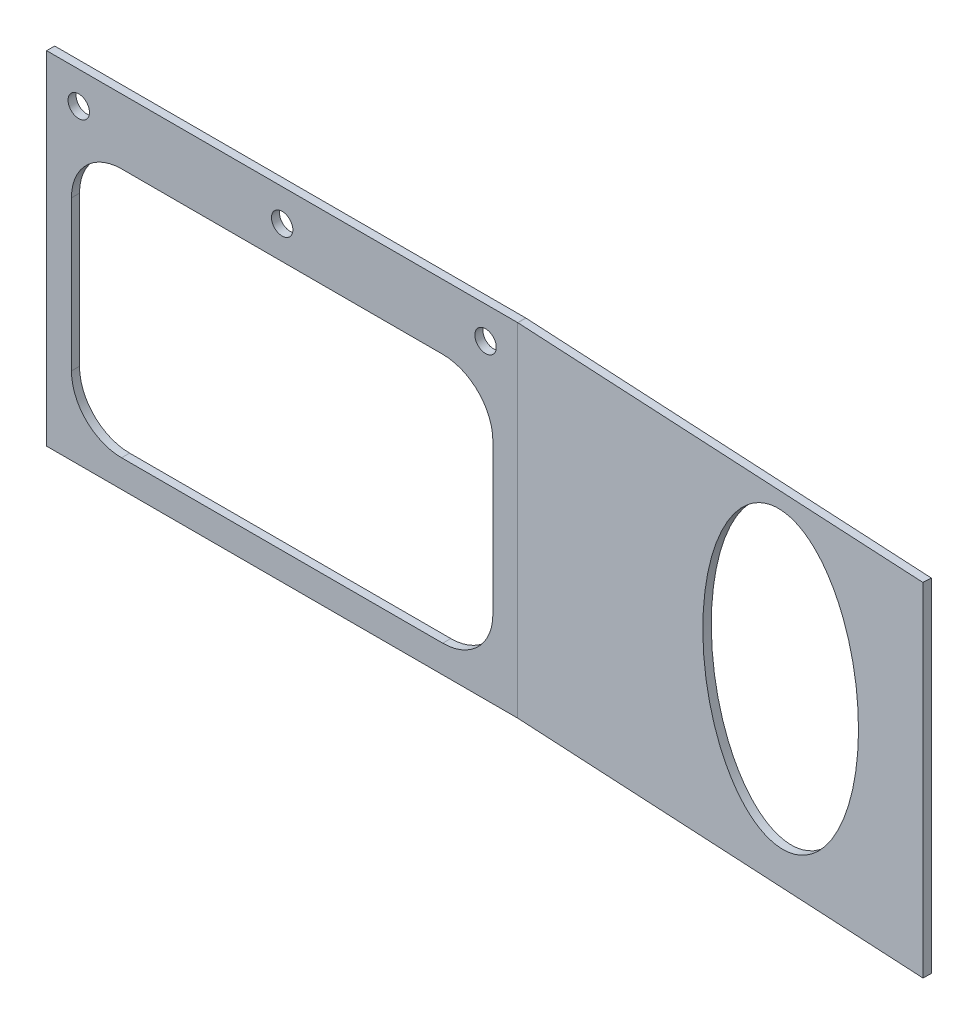
ISO-10303-21;
HEADER;
FILE_DESCRIPTION(('STEP AP214'),'2;1');
FILE_NAME('part.step','',(''),(''),'','','');
FILE_SCHEMA(('AUTOMOTIVE_DESIGN { 1 0 10303 214 1 1 1 1 }'));
ENDSEC;
DATA;
#1=APPLICATION_CONTEXT('core data for automotive mechanical design processes');
#2=APPLICATION_PROTOCOL_DEFINITION('international standard','automotive_design',2000,#1);
#3=PRODUCT_CONTEXT('',#1,'mechanical');
#4=PRODUCT('Part','Part','',(#3));
#5=PRODUCT_RELATED_PRODUCT_CATEGORY('part','',(#4));
#6=PRODUCT_DEFINITION_FORMATION('','',#4);
#7=PRODUCT_DEFINITION_CONTEXT('part definition',#1,'design');
#8=PRODUCT_DEFINITION('design','',#6,#7);
#9=PRODUCT_DEFINITION_SHAPE('','',#8);
#10=(LENGTH_UNIT() NAMED_UNIT(*) SI_UNIT(.MILLI.,.METRE.));
#11=(NAMED_UNIT(*) PLANE_ANGLE_UNIT() SI_UNIT($,.RADIAN.));
#12=(NAMED_UNIT(*) SI_UNIT($,.STERADIAN.) SOLID_ANGLE_UNIT());
#13=UNCERTAINTY_MEASURE_WITH_UNIT(LENGTH_MEASURE(1.E-05),#10,'distance_accuracy_value','');
#14=(GEOMETRIC_REPRESENTATION_CONTEXT(3) GLOBAL_UNCERTAINTY_ASSIGNED_CONTEXT((#13)) GLOBAL_UNIT_ASSIGNED_CONTEXT((#10,
#11,#12)) REPRESENTATION_CONTEXT('',''));
#15=CARTESIAN_POINT('',(0.,0.,0.));
#16=DIRECTION('',(0.,0.,1.));
#17=DIRECTION('',(1.,0.,0.));
#18=AXIS2_PLACEMENT_3D('',#15,#16,#17);
#19=CARTESIAN_POINT('',(-279.4,0.,-4.7752));
#20=DIRECTION('',(0.,0.,-1.));
#21=DIRECTION('',(-1.,0.,0.));
#22=AXIS2_PLACEMENT_3D('',#19,#20,#21);
#23=PLANE('',#22);
#24=CARTESIAN_POINT('',(-19.05,184.15,-4.7752));
#25=DIRECTION('',(0.,0.,-1.));
#26=DIRECTION('',(-1.,0.,0.));
#27=AXIS2_PLACEMENT_3D('',#24,#25,#26);
#28=CIRCLE('',#27,6.35);
#29=CARTESIAN_POINT('',(-25.4,184.15,-4.7752));
#30=VERTEX_POINT('',#29);
#31=EDGE_CURVE('E249',#30,#30,#28,.T.);
#32=ORIENTED_EDGE('',*,*,#31,.F.);
#33=EDGE_LOOP('',(#32));
#34=FACE_BOUND('',#33,.T.);
#35=CARTESIAN_POINT('',(-139.7,184.15,-4.7752));
#36=DIRECTION('',(0.,0.,-1.));
#37=DIRECTION('',(-1.,0.,0.));
#38=AXIS2_PLACEMENT_3D('',#35,#36,#37);
#39=CIRCLE('',#38,6.34999999999999);
#40=CARTESIAN_POINT('',(-146.05,184.15,-4.7752));
#41=VERTEX_POINT('',#40);
#42=EDGE_CURVE('E254',#41,#41,#39,.T.);
#43=ORIENTED_EDGE('',*,*,#42,.F.);
#44=EDGE_LOOP('',(#43));
#45=FACE_BOUND('',#44,.T.);
#46=CARTESIAN_POINT('',(-260.35,184.15,-4.7752));
#47=DIRECTION('',(0.,0.,-1.));
#48=DIRECTION('',(-1.,0.,0.));
#49=AXIS2_PLACEMENT_3D('',#46,#47,#48);
#50=CIRCLE('',#49,6.34999999999994);
#51=CARTESIAN_POINT('',(-266.7,184.15,-4.7752));
#52=VERTEX_POINT('',#51);
#53=EDGE_CURVE('E257',#52,#52,#50,.T.);
#54=ORIENTED_EDGE('',*,*,#53,.F.);
#55=EDGE_LOOP('',(#54));
#56=FACE_BOUND('',#55,.T.);
#57=CARTESIAN_POINT('',(-44.45,134.9375,-4.7752));
#58=DIRECTION('',(0.,0.,-1.));
#59=DIRECTION('',(-1.,0.,0.));
#60=AXIS2_PLACEMENT_3D('',#57,#58,#59);
#61=CIRCLE('',#60,29.7434);
#62=CARTESIAN_POINT('',(-44.45,164.6809,-4.7752));
#63=VERTEX_POINT('',#62);
#64=CARTESIAN_POINT('',(-14.7066,134.9375,-4.7752));
#65=VERTEX_POINT('',#64);
#66=EDGE_CURVE('E259',#63,#65,#61,.T.);
#67=ORIENTED_EDGE('',*,*,#66,.F.);
#68=DIRECTION('',(1.,0.,0.));
#69=VECTOR('',#68,1.);
#70=CARTESIAN_POINT('',(-44.45,164.6809,-4.7752));
#71=LINE('',#70,#69);
#72=CARTESIAN_POINT('',(-234.95,164.6809,-4.7752));
#73=VERTEX_POINT('',#72);
#74=EDGE_CURVE('E277',#73,#63,#71,.T.);
#75=ORIENTED_EDGE('',*,*,#74,.F.);
#76=CARTESIAN_POINT('',(-234.95,134.9375,-4.7752));
#77=DIRECTION('',(0.,0.,-1.));
#78=DIRECTION('',(-1.,0.,0.));
#79=AXIS2_PLACEMENT_3D('',#76,#77,#78);
#80=CIRCLE('',#79,29.7434);
#81=CARTESIAN_POINT('',(-264.6934,134.9375,-4.7752));
#82=VERTEX_POINT('',#81);
#83=EDGE_CURVE('E274',#82,#73,#80,.T.);
#84=ORIENTED_EDGE('',*,*,#83,.F.);
#85=DIRECTION('',(0.,1.,0.));
#86=VECTOR('',#85,1.);
#87=CARTESIAN_POINT('',(-264.6934,134.9375,-4.7752));
#88=LINE('',#87,#86);
#89=CARTESIAN_POINT('',(-264.6934,46.0375,-4.7752));
#90=VERTEX_POINT('',#89);
#91=EDGE_CURVE('E271',#90,#82,#88,.T.);
#92=ORIENTED_EDGE('',*,*,#91,.F.);
#93=CARTESIAN_POINT('',(-234.95,46.0375,-4.7752));
#94=DIRECTION('',(0.,0.,-1.));
#95=DIRECTION('',(1.,0.,0.));
#96=AXIS2_PLACEMENT_3D('',#93,#94,#95);
#97=CIRCLE('',#96,29.7434);
#98=CARTESIAN_POINT('',(-234.95,16.2941,-4.7752));
#99=VERTEX_POINT('',#98);
#100=EDGE_CURVE('E268',#99,#90,#97,.T.);
#101=ORIENTED_EDGE('',*,*,#100,.F.);
#102=DIRECTION('',(-1.,0.,0.));
#103=VECTOR('',#102,1.);
#104=CARTESIAN_POINT('',(-44.45,16.2941,-4.7752));
#105=LINE('',#104,#103);
#106=CARTESIAN_POINT('',(-44.45,16.2941,-4.7752));
#107=VERTEX_POINT('',#106);
#108=EDGE_CURVE('E265',#107,#99,#105,.T.);
#109=ORIENTED_EDGE('',*,*,#108,.F.);
#110=CARTESIAN_POINT('',(-44.45,46.0375,-4.7752));
#111=DIRECTION('',(0.,0.,-1.));
#112=DIRECTION('',(-1.,0.,0.));
#113=AXIS2_PLACEMENT_3D('',#110,#111,#112);
#114=CIRCLE('',#113,29.7434);
#115=CARTESIAN_POINT('',(-14.7066,46.0375,-4.7752));
#116=VERTEX_POINT('',#115);
#117=EDGE_CURVE('E262',#116,#107,#114,.T.);
#118=ORIENTED_EDGE('',*,*,#117,.F.);
#119=DIRECTION('',(0.,-1.,0.));
#120=VECTOR('',#119,1.);
#121=CARTESIAN_POINT('',(-14.7066,134.9375,-4.7752));
#122=LINE('',#121,#120);
#123=EDGE_CURVE('E56',#65,#116,#122,.T.);
#124=ORIENTED_EDGE('',*,*,#123,.F.);
#125=EDGE_LOOP('',(#67,#75,#84,#92,#101,#109,#118,#124));
#126=FACE_BOUND('',#125,.T.);
#127=DIRECTION('',(1.,0.,0.));
#128=VECTOR('',#127,1.);
#129=CARTESIAN_POINT('',(-279.4,203.2,-4.7752));
#130=LINE('',#129,#128);
#131=CARTESIAN_POINT('',(-279.4,203.2,-4.7752));
#132=VERTEX_POINT('',#131);
#133=CARTESIAN_POINT('',(-0.00665122407857607,203.2,-4.7752000000003));
#134=VERTEX_POINT('',#133);
#135=EDGE_CURVE('E231',#132,#134,#130,.T.);
#136=ORIENTED_EDGE('',*,*,#135,.T.);
#137=DIRECTION('',(0.,1.,0.));
#138=VECTOR('',#137,1.);
#139=CARTESIAN_POINT('',(-0.00665122407857606,203.2,-4.7752000000003));
#140=LINE('',#139,#138);
#141=CARTESIAN_POINT('',(-0.00665122407857608,0.,-4.7752));
#142=VERTEX_POINT('',#141);
#143=EDGE_CURVE('E208',#134,#142,#140,.F.);
#144=ORIENTED_EDGE('',*,*,#143,.T.);
#145=DIRECTION('',(1.,0.,0.));
#146=VECTOR('',#145,1.);
#147=CARTESIAN_POINT('',(-279.4,0.,-4.7752));
#148=LINE('',#147,#146);
#149=CARTESIAN_POINT('',(-279.4,0.,-4.7752));
#150=VERTEX_POINT('',#149);
#151=EDGE_CURVE('E234',#150,#142,#148,.T.);
#152=ORIENTED_EDGE('',*,*,#151,.F.);
#153=DIRECTION('',(0.,1.,0.));
#154=VECTOR('',#153,1.);
#155=CARTESIAN_POINT('',(-279.4,0.,-4.7752));
#156=LINE('',#155,#154);
#157=EDGE_CURVE('E217',#150,#132,#156,.T.);
#158=ORIENTED_EDGE('',*,*,#157,.T.);
#159=EDGE_LOOP('',(#136,#144,#152,#158));
#160=FACE_BOUND('',#159,.T.);
#161=ADVANCED_FACE('F48',(#34,#45,#56,#126,#160),#23,.T.);
#162=CARTESIAN_POINT('',(-279.4,0.,-4.7752));
#163=DIRECTION('',(0.,1.,0.));
#164=DIRECTION('',(0.,0.,1.));
#165=AXIS2_PLACEMENT_3D('',#162,#163,#164);
#166=PLANE('',#165);
#167=DIRECTION('',(0.,0.,-1.));
#168=VECTOR('',#167,1.);
#169=CARTESIAN_POINT('',(-0.00665122407857607,0.,0.));
#170=LINE('',#169,#168);
#171=CARTESIAN_POINT('',(-0.00665122407857607,0.,0.));
#172=VERTEX_POINT('',#171);
#173=EDGE_CURVE('E215',#172,#142,#170,.T.);
#174=ORIENTED_EDGE('',*,*,#173,.F.);
#175=DIRECTION('',(1.,0.,0.));
#176=VECTOR('',#175,1.);
#177=CARTESIAN_POINT('',(-279.4,0.,0.));
#178=LINE('',#177,#176);
#179=CARTESIAN_POINT('',(-279.4,0.,0.));
#180=VERTEX_POINT('',#179);
#181=EDGE_CURVE('E230',#180,#172,#178,.T.);
#182=ORIENTED_EDGE('',*,*,#181,.F.);
#183=DIRECTION('',(0.,0.,1.));
#184=VECTOR('',#183,1.);
#185=CARTESIAN_POINT('',(-279.4,0.,-4.7752));
#186=LINE('',#185,#184);
#187=EDGE_CURVE('E238',#150,#180,#186,.T.);
#188=ORIENTED_EDGE('',*,*,#187,.F.);
#189=ORIENTED_EDGE('',*,*,#151,.T.);
#190=EDGE_LOOP('',(#174,#182,#188,#189));
#191=FACE_BOUND('',#190,.T.);
#192=ADVANCED_FACE('F357',(#191),#166,.F.);
#193=CARTESIAN_POINT('',(-279.4,0.,0.));
#194=DIRECTION('',(0.,0.,-1.));
#195=DIRECTION('',(-1.,0.,0.));
#196=AXIS2_PLACEMENT_3D('',#193,#194,#195);
#197=PLANE('',#196);
#198=CARTESIAN_POINT('',(-19.05,184.15,0.));
#199=DIRECTION('',(0.,0.,-1.));
#200=DIRECTION('',(-1.,0.,0.));
#201=AXIS2_PLACEMENT_3D('',#198,#199,#200);
#202=CIRCLE('',#201,6.35);
#203=CARTESIAN_POINT('',(-25.4,184.15,0.));
#204=VERTEX_POINT('',#203);
#205=EDGE_CURVE('E227',#204,#204,#202,.T.);
#206=ORIENTED_EDGE('',*,*,#205,.T.);
#207=EDGE_LOOP('',(#206));
#208=FACE_BOUND('',#207,.T.);
#209=CARTESIAN_POINT('',(-139.7,184.15,0.));
#210=DIRECTION('',(0.,0.,-1.));
#211=DIRECTION('',(-1.,0.,0.));
#212=AXIS2_PLACEMENT_3D('',#209,#210,#211);
#213=CIRCLE('',#212,6.34999999999999);
#214=CARTESIAN_POINT('',(-146.05,184.15,0.));
#215=VERTEX_POINT('',#214);
#216=EDGE_CURVE('E223',#215,#215,#213,.T.);
#217=ORIENTED_EDGE('',*,*,#216,.T.);
#218=EDGE_LOOP('',(#217));
#219=FACE_BOUND('',#218,.T.);
#220=CARTESIAN_POINT('',(-260.35,184.15,0.));
#221=DIRECTION('',(0.,0.,-1.));
#222=DIRECTION('',(-1.,0.,0.));
#223=AXIS2_PLACEMENT_3D('',#220,#221,#222);
#224=CIRCLE('',#223,6.34999999999994);
#225=CARTESIAN_POINT('',(-266.7,184.15,0.));
#226=VERTEX_POINT('',#225);
#227=EDGE_CURVE('E220',#226,#226,#224,.T.);
#228=ORIENTED_EDGE('',*,*,#227,.T.);
#229=EDGE_LOOP('',(#228));
#230=FACE_BOUND('',#229,.T.);
#231=DIRECTION('',(1.,0.,0.));
#232=VECTOR('',#231,1.);
#233=CARTESIAN_POINT('',(-44.45,164.6809,0.));
#234=LINE('',#233,#232);
#235=CARTESIAN_POINT('',(-234.95,164.6809,0.));
#236=VERTEX_POINT('',#235);
#237=CARTESIAN_POINT('',(-44.45,164.6809,0.));
#238=VERTEX_POINT('',#237);
#239=EDGE_CURVE('E243',#236,#238,#234,.T.);
#240=ORIENTED_EDGE('',*,*,#239,.T.);
#241=CARTESIAN_POINT('',(-44.45,134.9375,0.));
#242=DIRECTION('',(0.,0.,-1.));
#243=DIRECTION('',(-1.,0.,0.));
#244=AXIS2_PLACEMENT_3D('',#241,#242,#243);
#245=CIRCLE('',#244,29.7434);
#246=CARTESIAN_POINT('',(-14.7066,134.9375,0.));
#247=VERTEX_POINT('',#246);
#248=EDGE_CURVE('E282',#238,#247,#245,.T.);
#249=ORIENTED_EDGE('',*,*,#248,.T.);
#250=DIRECTION('',(0.,-1.,0.));
#251=VECTOR('',#250,1.);
#252=CARTESIAN_POINT('',(-14.7066,134.9375,0.));
#253=LINE('',#252,#251);
#254=CARTESIAN_POINT('',(-14.7066,46.0375,0.));
#255=VERTEX_POINT('',#254);
#256=EDGE_CURVE('E297',#247,#255,#253,.T.);
#257=ORIENTED_EDGE('',*,*,#256,.T.);
#258=CARTESIAN_POINT('',(-44.45,46.0375,0.));
#259=DIRECTION('',(0.,0.,-1.));
#260=DIRECTION('',(-1.,0.,0.));
#261=AXIS2_PLACEMENT_3D('',#258,#259,#260);
#262=CIRCLE('',#261,29.7434);
#263=CARTESIAN_POINT('',(-44.45,16.2941,0.));
#264=VERTEX_POINT('',#263);
#265=EDGE_CURVE('E294',#255,#264,#262,.T.);
#266=ORIENTED_EDGE('',*,*,#265,.T.);
#267=DIRECTION('',(-1.,0.,0.));
#268=VECTOR('',#267,1.);
#269=CARTESIAN_POINT('',(-44.45,16.2941,0.));
#270=LINE('',#269,#268);
#271=CARTESIAN_POINT('',(-234.95,16.2941,0.));
#272=VERTEX_POINT('',#271);
#273=EDGE_CURVE('E291',#264,#272,#270,.T.);
#274=ORIENTED_EDGE('',*,*,#273,.T.);
#275=CARTESIAN_POINT('',(-234.95,46.0375,0.));
#276=DIRECTION('',(0.,0.,-1.));
#277=DIRECTION('',(1.,0.,0.));
#278=AXIS2_PLACEMENT_3D('',#275,#276,#277);
#279=CIRCLE('',#278,29.7434);
#280=CARTESIAN_POINT('',(-264.6934,46.0375,0.));
#281=VERTEX_POINT('',#280);
#282=EDGE_CURVE('E288',#272,#281,#279,.T.);
#283=ORIENTED_EDGE('',*,*,#282,.T.);
#284=DIRECTION('',(0.,1.,0.));
#285=VECTOR('',#284,1.);
#286=CARTESIAN_POINT('',(-264.6934,134.9375,0.));
#287=LINE('',#286,#285);
#288=CARTESIAN_POINT('',(-264.6934,134.9375,0.));
#289=VERTEX_POINT('',#288);
#290=EDGE_CURVE('E285',#281,#289,#287,.T.);
#291=ORIENTED_EDGE('',*,*,#290,.T.);
#292=CARTESIAN_POINT('',(-234.95,134.9375,0.));
#293=DIRECTION('',(0.,0.,-1.));
#294=DIRECTION('',(-1.,0.,0.));
#295=AXIS2_PLACEMENT_3D('',#292,#293,#294);
#296=CIRCLE('',#295,29.7434);
#297=EDGE_CURVE('E224',#289,#236,#296,.T.);
#298=ORIENTED_EDGE('',*,*,#297,.T.);
#299=EDGE_LOOP('',(#240,#249,#257,#266,#274,#283,#291,#298));
#300=FACE_BOUND('',#299,.T.);
#301=DIRECTION('',(0.,1.,0.));
#302=VECTOR('',#301,1.);
#303=CARTESIAN_POINT('',(-0.00665122407857607,203.2,-3.0457618658304E-13));
#304=LINE('',#303,#302);
#305=CARTESIAN_POINT('',(-0.00665122407857607,203.2,-3.04552390251178E-13));
#306=VERTEX_POINT('',#305);
#307=EDGE_CURVE('E204',#306,#172,#304,.F.);
#308=ORIENTED_EDGE('',*,*,#307,.F.);
#309=DIRECTION('',(1.,0.,0.));
#310=VECTOR('',#309,1.);
#311=CARTESIAN_POINT('',(-279.4,203.2,0.));
#312=LINE('',#311,#310);
#313=CARTESIAN_POINT('',(-279.4,203.2,0.));
#314=VERTEX_POINT('',#313);
#315=EDGE_CURVE('E235',#314,#306,#312,.T.);
#316=ORIENTED_EDGE('',*,*,#315,.F.);
#317=DIRECTION('',(0.,1.,0.));
#318=VECTOR('',#317,1.);
#319=CARTESIAN_POINT('',(-279.4,0.,0.));
#320=LINE('',#319,#318);
#321=EDGE_CURVE('E245',#180,#314,#320,.T.);
#322=ORIENTED_EDGE('',*,*,#321,.F.);
#323=ORIENTED_EDGE('',*,*,#181,.T.);
#324=EDGE_LOOP('',(#308,#316,#322,#323));
#325=FACE_BOUND('',#324,.T.);
#326=ADVANCED_FACE('F333',(#208,#219,#230,#300,#325),#197,.F.);
#327=CARTESIAN_POINT('',(-279.4,203.2,0.));
#328=DIRECTION('',(0.,-1.,0.));
#329=DIRECTION('',(0.,0.,-1.));
#330=AXIS2_PLACEMENT_3D('',#327,#328,#329);
#331=PLANE('',#330);
#332=DIRECTION('',(0.,0.,-1.));
#333=VECTOR('',#332,1.);
#334=CARTESIAN_POINT('',(-0.00665122407857607,203.2,-3.04552390251178E-13));
#335=LINE('',#334,#333);
#336=EDGE_CURVE('E212',#306,#134,#335,.T.);
#337=ORIENTED_EDGE('',*,*,#336,.T.);
#338=ORIENTED_EDGE('',*,*,#135,.F.);
#339=DIRECTION('',(0.,0.,-1.));
#340=VECTOR('',#339,1.);
#341=CARTESIAN_POINT('',(-279.4,203.2,0.));
#342=LINE('',#341,#340);
#343=EDGE_CURVE('E247',#314,#132,#342,.T.);
#344=ORIENTED_EDGE('',*,*,#343,.F.);
#345=ORIENTED_EDGE('',*,*,#315,.T.);
#346=EDGE_LOOP('',(#337,#338,#344,#345));
#347=FACE_BOUND('',#346,.T.);
#348=ADVANCED_FACE('F378',(#347),#331,.F.);
#349=CARTESIAN_POINT('',(-279.4,203.2,-4.7752));
#350=DIRECTION('',(-1.,0.,0.));
#351=DIRECTION('',(0.,0.,1.));
#352=AXIS2_PLACEMENT_3D('',#349,#350,#351);
#353=PLANE('',#352);
#354=ORIENTED_EDGE('',*,*,#157,.F.);
#355=ORIENTED_EDGE('',*,*,#187,.T.);
#356=ORIENTED_EDGE('',*,*,#321,.T.);
#357=ORIENTED_EDGE('',*,*,#343,.T.);
#358=EDGE_LOOP('',(#354,#355,#356,#357));
#359=FACE_BOUND('',#358,.T.);
#360=ADVANCED_FACE('F383',(#359),#353,.T.);
#361=CARTESIAN_POINT('',(-19.05,184.15,5.3848));
#362=DIRECTION('',(0.,0.,-1.));
#363=DIRECTION('',(-1.,0.,0.));
#364=AXIS2_PLACEMENT_3D('',#361,#362,#363);
#365=CYLINDRICAL_SURFACE('',#364,6.35);
#366=ORIENTED_EDGE('',*,*,#31,.T.);
#367=EDGE_LOOP('',(#366));
#368=FACE_BOUND('',#367,.T.);
#369=ORIENTED_EDGE('',*,*,#205,.F.);
#370=EDGE_LOOP('',(#369));
#371=FACE_BOUND('',#370,.T.);
#372=ADVANCED_FACE('F594',(#368,#371),#365,.F.);
#373=CARTESIAN_POINT('',(-139.7,184.15,5.3848));
#374=DIRECTION('',(0.,0.,-1.));
#375=DIRECTION('',(-1.,0.,0.));
#376=AXIS2_PLACEMENT_3D('',#373,#374,#375);
#377=CYLINDRICAL_SURFACE('',#376,6.34999999999999);
#378=ORIENTED_EDGE('',*,*,#42,.T.);
#379=EDGE_LOOP('',(#378));
#380=FACE_BOUND('',#379,.T.);
#381=ORIENTED_EDGE('',*,*,#216,.F.);
#382=EDGE_LOOP('',(#381));
#383=FACE_BOUND('',#382,.T.);
#384=ADVANCED_FACE('F373',(#380,#383),#377,.F.);
#385=CARTESIAN_POINT('',(-260.35,184.15,5.3848));
#386=DIRECTION('',(0.,0.,-1.));
#387=DIRECTION('',(-1.,0.,0.));
#388=AXIS2_PLACEMENT_3D('',#385,#386,#387);
#389=CYLINDRICAL_SURFACE('',#388,6.34999999999994);
#390=ORIENTED_EDGE('',*,*,#53,.T.);
#391=EDGE_LOOP('',(#390));
#392=FACE_BOUND('',#391,.T.);
#393=ORIENTED_EDGE('',*,*,#227,.F.);
#394=EDGE_LOOP('',(#393));
#395=FACE_BOUND('',#394,.T.);
#396=ADVANCED_FACE('F370',(#392,#395),#389,.F.);
#397=CARTESIAN_POINT('',(-44.45,134.9375,0.));
#398=DIRECTION('',(0.,0.,-1.));
#399=DIRECTION('',(-1.,0.,0.));
#400=AXIS2_PLACEMENT_3D('',#397,#398,#399);
#401=CYLINDRICAL_SURFACE('',#400,29.7434);
#402=ORIENTED_EDGE('',*,*,#66,.T.);
#403=DIRECTION('',(0.,0.,-1.));
#404=VECTOR('',#403,1.);
#405=CARTESIAN_POINT('',(-14.7066,134.9375,0.));
#406=LINE('',#405,#404);
#407=EDGE_CURVE('E11',#247,#65,#406,.T.);
#408=ORIENTED_EDGE('',*,*,#407,.F.);
#409=ORIENTED_EDGE('',*,*,#248,.F.);
#410=DIRECTION('',(0.,0.,-1.));
#411=VECTOR('',#410,1.);
#412=CARTESIAN_POINT('',(-44.45,164.6809,0.));
#413=LINE('',#412,#411);
#414=EDGE_CURVE('E278',#238,#63,#413,.T.);
#415=ORIENTED_EDGE('',*,*,#414,.T.);
#416=EDGE_LOOP('',(#402,#408,#409,#415));
#417=FACE_BOUND('',#416,.T.);
#418=ADVANCED_FACE('F315',(#417),#401,.F.);
#419=CARTESIAN_POINT('',(-44.45,164.6809,0.));
#420=DIRECTION('',(0.,1.,0.));
#421=DIRECTION('',(0.,0.,1.));
#422=AXIS2_PLACEMENT_3D('',#419,#420,#421);
#423=PLANE('',#422);
#424=ORIENTED_EDGE('',*,*,#74,.T.);
#425=ORIENTED_EDGE('',*,*,#414,.F.);
#426=ORIENTED_EDGE('',*,*,#239,.F.);
#427=DIRECTION('',(0.,0.,-1.));
#428=VECTOR('',#427,1.);
#429=CARTESIAN_POINT('',(-234.95,164.6809,0.));
#430=LINE('',#429,#428);
#431=EDGE_CURVE('E275',#236,#73,#430,.T.);
#432=ORIENTED_EDGE('',*,*,#431,.T.);
#433=EDGE_LOOP('',(#424,#425,#426,#432));
#434=FACE_BOUND('',#433,.T.);
#435=ADVANCED_FACE('F338',(#434),#423,.F.);
#436=CARTESIAN_POINT('',(-234.95,134.9375,0.));
#437=DIRECTION('',(0.,0.,-1.));
#438=DIRECTION('',(-1.,0.,0.));
#439=AXIS2_PLACEMENT_3D('',#436,#437,#438);
#440=CYLINDRICAL_SURFACE('',#439,29.7434);
#441=ORIENTED_EDGE('',*,*,#83,.T.);
#442=ORIENTED_EDGE('',*,*,#431,.F.);
#443=ORIENTED_EDGE('',*,*,#297,.F.);
#444=DIRECTION('',(0.,0.,-1.));
#445=VECTOR('',#444,1.);
#446=CARTESIAN_POINT('',(-264.6934,134.9375,0.));
#447=LINE('',#446,#445);
#448=EDGE_CURVE('E272',#289,#82,#447,.T.);
#449=ORIENTED_EDGE('',*,*,#448,.T.);
#450=EDGE_LOOP('',(#441,#442,#443,#449));
#451=FACE_BOUND('',#450,.T.);
#452=ADVANCED_FACE('F342',(#451),#440,.F.);
#453=CARTESIAN_POINT('',(-264.6934,134.9375,0.));
#454=DIRECTION('',(-1.,0.,0.));
#455=DIRECTION('',(0.,0.,1.));
#456=AXIS2_PLACEMENT_3D('',#453,#454,#455);
#457=PLANE('',#456);
#458=ORIENTED_EDGE('',*,*,#91,.T.);
#459=ORIENTED_EDGE('',*,*,#448,.F.);
#460=ORIENTED_EDGE('',*,*,#290,.F.);
#461=DIRECTION('',(0.,0.,-1.));
#462=VECTOR('',#461,1.);
#463=CARTESIAN_POINT('',(-264.6934,46.0375,0.));
#464=LINE('',#463,#462);
#465=EDGE_CURVE('E269',#281,#90,#464,.T.);
#466=ORIENTED_EDGE('',*,*,#465,.T.);
#467=EDGE_LOOP('',(#458,#459,#460,#466));
#468=FACE_BOUND('',#467,.T.);
#469=ADVANCED_FACE('F345',(#468),#457,.F.);
#470=CARTESIAN_POINT('',(-234.95,46.0375,0.));
#471=DIRECTION('',(0.,0.,-1.));
#472=DIRECTION('',(-1.,0.,0.));
#473=AXIS2_PLACEMENT_3D('',#470,#471,#472);
#474=CYLINDRICAL_SURFACE('',#473,29.7434);
#475=ORIENTED_EDGE('',*,*,#100,.T.);
#476=ORIENTED_EDGE('',*,*,#465,.F.);
#477=ORIENTED_EDGE('',*,*,#282,.F.);
#478=DIRECTION('',(0.,0.,-1.));
#479=VECTOR('',#478,1.);
#480=CARTESIAN_POINT('',(-234.95,16.2941,0.));
#481=LINE('',#480,#479);
#482=EDGE_CURVE('E266',#272,#99,#481,.T.);
#483=ORIENTED_EDGE('',*,*,#482,.T.);
#484=EDGE_LOOP('',(#475,#476,#477,#483));
#485=FACE_BOUND('',#484,.T.);
#486=ADVANCED_FACE('F347',(#485),#474,.F.);
#487=CARTESIAN_POINT('',(-44.45,16.2941,0.));
#488=DIRECTION('',(0.,-1.,0.));
#489=DIRECTION('',(0.,0.,-1.));
#490=AXIS2_PLACEMENT_3D('',#487,#488,#489);
#491=PLANE('',#490);
#492=ORIENTED_EDGE('',*,*,#108,.T.);
#493=ORIENTED_EDGE('',*,*,#482,.F.);
#494=ORIENTED_EDGE('',*,*,#273,.F.);
#495=DIRECTION('',(0.,0.,-1.));
#496=VECTOR('',#495,1.);
#497=CARTESIAN_POINT('',(-44.45,16.2941,0.));
#498=LINE('',#497,#496);
#499=EDGE_CURVE('E263',#264,#107,#498,.T.);
#500=ORIENTED_EDGE('',*,*,#499,.T.);
#501=EDGE_LOOP('',(#492,#493,#494,#500));
#502=FACE_BOUND('',#501,.T.);
#503=ADVANCED_FACE('F330',(#502),#491,.F.);
#504=CARTESIAN_POINT('',(-44.45,46.0375,0.));
#505=DIRECTION('',(0.,0.,-1.));
#506=DIRECTION('',(-1.,0.,0.));
#507=AXIS2_PLACEMENT_3D('',#504,#505,#506);
#508=CYLINDRICAL_SURFACE('',#507,29.7434);
#509=ORIENTED_EDGE('',*,*,#117,.T.);
#510=ORIENTED_EDGE('',*,*,#499,.F.);
#511=ORIENTED_EDGE('',*,*,#265,.F.);
#512=DIRECTION('',(0.,0.,-1.));
#513=VECTOR('',#512,1.);
#514=CARTESIAN_POINT('',(-14.7066,46.0375,0.));
#515=LINE('',#514,#513);
#516=EDGE_CURVE('E72',#255,#116,#515,.T.);
#517=ORIENTED_EDGE('',*,*,#516,.T.);
#518=EDGE_LOOP('',(#509,#510,#511,#517));
#519=FACE_BOUND('',#518,.T.);
#520=ADVANCED_FACE('F327',(#519),#508,.F.);
#521=CARTESIAN_POINT('',(-14.7066,134.9375,0.));
#522=DIRECTION('',(1.,0.,0.));
#523=DIRECTION('',(0.,1.,0.));
#524=AXIS2_PLACEMENT_3D('',#521,#522,#523);
#525=PLANE('',#524);
#526=ORIENTED_EDGE('',*,*,#123,.T.);
#527=ORIENTED_EDGE('',*,*,#516,.F.);
#528=ORIENTED_EDGE('',*,*,#256,.F.);
#529=ORIENTED_EDGE('',*,*,#407,.T.);
#530=EDGE_LOOP('',(#526,#527,#528,#529));
#531=FACE_BOUND('',#530,.T.);
#532=ADVANCED_FACE('F322',(#531),#525,.F.);
#533=CARTESIAN_POINT('',(-0.00665122407857607,0.,0.254000000000065));
#534=DIRECTION('',(0.,-1.,0.));
#535=DIRECTION('',(0.,0.,-1.));
#536=AXIS2_PLACEMENT_3D('',#533,#534,#535);
#537=PLANE('',#536);
#538=DIRECTION('',(0.0523359562429376,0.,-0.998629534754574));
#539=VECTOR('',#538,1.);
#540=CARTESIAN_POINT('',(0.00664210880713352,0.,0.000348098172338156));
#541=LINE('',#540,#539);
#542=CARTESIAN_POINT('',(0.00664210880713353,0.,0.000348098172337234));
#543=VERTEX_POINT('',#542);
#544=CARTESIAN_POINT('',(0.256556767058409,0.,-4.76830765618771));
#545=VERTEX_POINT('',#544);
#546=EDGE_CURVE('E575',#543,#545,#541,.T.);
#547=ORIENTED_EDGE('',*,*,#546,.F.);
#548=CARTESIAN_POINT('',(-0.00665122407857607,0.,0.254000000000065));
#549=DIRECTION('',(0.,1.,0.));
#550=DIRECTION('',(0.,0.,1.));
#551=AXIS2_PLACEMENT_3D('',#548,#549,#550);
#552=CIRCLE('',#551,0.254000000000066);
#553=EDGE_CURVE('E200',#172,#543,#552,.F.);
#554=ORIENTED_EDGE('',*,*,#553,.F.);
#555=ORIENTED_EDGE('',*,*,#173,.T.);
#556=CARTESIAN_POINT('',(-0.00665122407857607,0.,0.254000000000065));
#557=DIRECTION('',(0.,1.,0.));
#558=DIRECTION('',(0.,0.,1.));
#559=AXIS2_PLACEMENT_3D('',#556,#557,#558);
#560=CIRCLE('',#559,5.02920000000007);
#561=EDGE_CURVE('E64',#142,#545,#560,.F.);
#562=ORIENTED_EDGE('',*,*,#561,.T.);
#563=EDGE_LOOP('',(#547,#554,#555,#562));
#564=FACE_BOUND('',#563,.T.);
#565=ADVANCED_FACE('F426',(#564),#537,.T.);
#566=CARTESIAN_POINT('',(-0.00665122407857607,203.2,0.253999999999761));
#567=DIRECTION('',(0.,-1.,0.));
#568=DIRECTION('',(0.,0.,-1.));
#569=AXIS2_PLACEMENT_3D('',#566,#567,#568);
#570=PLANE('',#569);
#571=CARTESIAN_POINT('',(-0.00665122407857607,203.2,0.253999999999761));
#572=DIRECTION('',(0.,1.,0.));
#573=DIRECTION('',(0.,0.,1.));
#574=AXIS2_PLACEMENT_3D('',#571,#572,#573);
#575=CIRCLE('',#574,0.254000000000066);
#576=CARTESIAN_POINT('',(0.00664210880713353,203.2,0.000348098172033658));
#577=VERTEX_POINT('',#576);
#578=EDGE_CURVE('E198',#577,#306,#575,.T.);
#579=ORIENTED_EDGE('',*,*,#578,.F.);
#580=DIRECTION('',(0.0523359562429376,0.,-0.998629534754574));
#581=VECTOR('',#580,1.);
#582=CARTESIAN_POINT('',(0.00664210880711759,203.2,0.000348098172337321));
#583=LINE('',#582,#581);
#584=CARTESIAN_POINT('',(0.256556767058401,203.2,-4.7683076561877));
#585=VERTEX_POINT('',#584);
#586=EDGE_CURVE('E574',#577,#585,#583,.T.);
#587=ORIENTED_EDGE('',*,*,#586,.T.);
#588=CARTESIAN_POINT('',(-0.00665122407857607,203.2,0.253999999999761));
#589=DIRECTION('',(0.,1.,0.));
#590=DIRECTION('',(0.,0.,1.));
#591=AXIS2_PLACEMENT_3D('',#588,#589,#590);
#592=CIRCLE('',#591,5.02920000000007);
#593=EDGE_CURVE('E203',#585,#134,#592,.T.);
#594=ORIENTED_EDGE('',*,*,#593,.T.);
#595=ORIENTED_EDGE('',*,*,#336,.F.);
#596=EDGE_LOOP('',(#579,#587,#594,#595));
#597=FACE_BOUND('',#596,.T.);
#598=ADVANCED_FACE('F459',(#597),#570,.F.);
#599=CARTESIAN_POINT('',(-0.00665122407857607,203.2,0.253999999999761));
#600=DIRECTION('',(0.,1.,0.));
#601=DIRECTION('',(0.0523359562429376,0.,-0.998629534754574));
#602=AXIS2_PLACEMENT_3D('',#599,#600,#601);
#603=CYLINDRICAL_SURFACE('',#602,5.02920000000007);
#604=ORIENTED_EDGE('',*,*,#143,.F.);
#605=ORIENTED_EDGE('',*,*,#593,.F.);
#606=DIRECTION('',(0.,1.,0.));
#607=VECTOR('',#606,1.);
#608=CARTESIAN_POINT('',(0.256556767058393,203.2,-4.76830765618771));
#609=LINE('',#608,#607);
#610=EDGE_CURVE('E174',#545,#585,#609,.T.);
#611=ORIENTED_EDGE('',*,*,#610,.F.);
#612=ORIENTED_EDGE('',*,*,#561,.F.);
#613=EDGE_LOOP('',(#604,#605,#611,#612));
#614=FACE_BOUND('',#613,.T.);
#615=ADVANCED_FACE('F462',(#614),#603,.T.);
#616=CARTESIAN_POINT('',(-0.00665122407857607,203.2,0.253999999999761));
#617=DIRECTION('',(0.,1.,0.));
#618=DIRECTION('',(0.0523359562429376,0.,-0.998629534754574));
#619=AXIS2_PLACEMENT_3D('',#616,#617,#618);
#620=CYLINDRICAL_SURFACE('',#619,0.254000000000066);
#621=ORIENTED_EDGE('',*,*,#307,.T.);
#622=ORIENTED_EDGE('',*,*,#553,.T.);
#623=DIRECTION('',(0.,1.,0.));
#624=VECTOR('',#623,1.);
#625=CARTESIAN_POINT('',(0.00664210880713352,0.,0.000348098172338156));
#626=LINE('',#625,#624);
#627=EDGE_CURVE('E171',#543,#577,#626,.T.);
#628=ORIENTED_EDGE('',*,*,#627,.T.);
#629=ORIENTED_EDGE('',*,*,#578,.T.);
#630=EDGE_LOOP('',(#621,#622,#628,#629));
#631=FACE_BOUND('',#630,.T.);
#632=ADVANCED_FACE('F472',(#631),#620,.F.);
#633=CARTESIAN_POINT('',(0.249914658251276,203.2,-4.76865575436004));
#634=DIRECTION('',(0.,1.,0.));
#635=DIRECTION('',(0.,0.,1.));
#636=AXIS2_PLACEMENT_3D('',#633,#634,#635);
#637=PLANE('',#636);
#638=DIRECTION('',(-0.998629534754574,0.,-0.0523359562429376));
#639=VECTOR('',#638,1.);
#640=CARTESIAN_POINT('',(0.249914658251276,203.2,-4.76865575436004));
#641=LINE('',#640,#639);
#642=CARTESIAN_POINT('',(253.901816485913,203.2,8.52467713134611));
#643=VERTEX_POINT('',#642);
#644=EDGE_CURVE('E185',#643,#585,#641,.T.);
#645=ORIENTED_EDGE('',*,*,#644,.T.);
#646=ORIENTED_EDGE('',*,*,#586,.F.);
#647=DIRECTION('',(-0.998629534754574,0.,-0.0523359562429376));
#648=VECTOR('',#647,1.);
#649=CARTESIAN_POINT('',(0.,203.2,0.));
#650=LINE('',#649,#648);
#651=CARTESIAN_POINT('',(253.651901827662,203.2,13.2933328857061));
#652=VERTEX_POINT('',#651);
#653=EDGE_CURVE('E188',#652,#577,#650,.T.);
#654=ORIENTED_EDGE('',*,*,#653,.F.);
#655=DIRECTION('',(-0.0523359562429376,0.,0.998629534754574));
#656=VECTOR('',#655,1.);
#657=CARTESIAN_POINT('',(253.901816485913,203.2,8.52467713134611));
#658=LINE('',#657,#656);
#659=EDGE_CURVE('E184',#643,#652,#658,.T.);
#660=ORIENTED_EDGE('',*,*,#659,.F.);
#661=EDGE_LOOP('',(#645,#646,#654,#660));
#662=FACE_BOUND('',#661,.T.);
#663=ADVANCED_FACE('F490',(#662),#637,.T.);
#664=CARTESIAN_POINT('',(253.901816485913,0.,8.52467713134611));
#665=DIRECTION('',(0.,-1.,0.));
#666=DIRECTION('',(0.,0.,-1.));
#667=AXIS2_PLACEMENT_3D('',#664,#665,#666);
#668=PLANE('',#667);
#669=DIRECTION('',(0.998629534754574,0.,0.0523359562429376));
#670=VECTOR('',#669,1.);
#671=CARTESIAN_POINT('',(253.651901827662,0.,13.2933328857061));
#672=LINE('',#671,#670);
#673=CARTESIAN_POINT('',(253.651901827662,0.,13.2933328857061));
#674=VERTEX_POINT('',#673);
#675=EDGE_CURVE('E164',#543,#674,#672,.T.);
#676=ORIENTED_EDGE('',*,*,#675,.F.);
#677=ORIENTED_EDGE('',*,*,#546,.T.);
#678=DIRECTION('',(0.998629534754574,0.,0.0523359562429376));
#679=VECTOR('',#678,1.);
#680=CARTESIAN_POINT('',(253.901816485913,0.,8.52467713134611));
#681=LINE('',#680,#679);
#682=CARTESIAN_POINT('',(253.901816485913,0.,8.52467713134611));
#683=VERTEX_POINT('',#682);
#684=EDGE_CURVE('E180',#545,#683,#681,.T.);
#685=ORIENTED_EDGE('',*,*,#684,.T.);
#686=DIRECTION('',(-0.0523359562429376,0.,0.998629534754574));
#687=VECTOR('',#686,1.);
#688=CARTESIAN_POINT('',(253.901816485913,0.,8.52467713134611));
#689=LINE('',#688,#687);
#690=EDGE_CURVE('E177',#683,#674,#689,.T.);
#691=ORIENTED_EDGE('',*,*,#690,.T.);
#692=EDGE_LOOP('',(#676,#677,#685,#691));
#693=FACE_BOUND('',#692,.T.);
#694=ADVANCED_FACE('F178',(#693),#668,.T.);
#695=CARTESIAN_POINT('',(0.249914658251276,203.2,-4.76865575436004));
#696=DIRECTION('',(0.0523359562429376,0.,-0.998629534754574));
#697=DIRECTION('',(-0.998629534754574,0.,-0.0523359562429376));
#698=AXIS2_PLACEMENT_3D('',#695,#696,#697);
#699=PLANE('',#698);
#700=CARTESIAN_POINT('',(164.867445681306,106.7816,3.85858347761436));
#701=DIRECTION('',(0.0523359562429376,0.,-0.998629534754574));
#702=DIRECTION('',(0.,-1.,0.));
#703=AXIS2_PLACEMENT_3D('',#700,#701,#702);
#704=ELLIPSE('',#703,86.8934,48.7934);
#705=CARTESIAN_POINT('',(164.867445681306,19.8882,3.85858347761436));
#706=VERTEX_POINT('',#705);
#707=EDGE_CURVE('E572',#706,#706,#704,.T.);
#708=ORIENTED_EDGE('',*,*,#707,.F.);
#709=EDGE_LOOP('',(#708));
#710=FACE_BOUND('',#709,.T.);
#711=ORIENTED_EDGE('',*,*,#684,.F.);
#712=ORIENTED_EDGE('',*,*,#610,.T.);
#713=ORIENTED_EDGE('',*,*,#644,.F.);
#714=DIRECTION('',(0.,1.,0.));
#715=VECTOR('',#714,1.);
#716=CARTESIAN_POINT('',(253.901816485913,203.2,8.52467713134611));
#717=LINE('',#716,#715);
#718=EDGE_CURVE('E194',#683,#643,#717,.T.);
#719=ORIENTED_EDGE('',*,*,#718,.F.);
#720=EDGE_LOOP('',(#711,#712,#713,#719));
#721=FACE_BOUND('',#720,.T.);
#722=ADVANCED_FACE('F511',(#710,#721),#699,.T.);
#723=CARTESIAN_POINT('',(0.,203.2,0.));
#724=DIRECTION('',(0.0523359562429376,0.,-0.998629534754574));
#725=DIRECTION('',(-0.998629534754574,0.,-0.0523359562429376));
#726=AXIS2_PLACEMENT_3D('',#723,#724,#725);
#727=PLANE('',#726);
#728=CARTESIAN_POINT('',(164.617531023055,106.7816,8.62723923197442));
#729=DIRECTION('',(0.0523359562429376,0.,-0.998629534754574));
#730=DIRECTION('',(0.,-1.,0.));
#731=AXIS2_PLACEMENT_3D('',#728,#729,#730);
#732=ELLIPSE('',#731,86.8934,48.7934);
#733=CARTESIAN_POINT('',(164.617531023054,19.8882,8.62723923197442));
#734=VERTEX_POINT('',#733);
#735=EDGE_CURVE('E51',#734,#734,#732,.T.);
#736=ORIENTED_EDGE('',*,*,#735,.T.);
#737=EDGE_LOOP('',(#736));
#738=FACE_BOUND('',#737,.T.);
#739=ORIENTED_EDGE('',*,*,#627,.F.);
#740=ORIENTED_EDGE('',*,*,#675,.T.);
#741=DIRECTION('',(0.,1.,0.));
#742=VECTOR('',#741,1.);
#743=CARTESIAN_POINT('',(253.651901827662,203.2,13.2933328857061));
#744=LINE('',#743,#742);
#745=EDGE_CURVE('E169',#674,#652,#744,.T.);
#746=ORIENTED_EDGE('',*,*,#745,.T.);
#747=ORIENTED_EDGE('',*,*,#653,.T.);
#748=EDGE_LOOP('',(#739,#740,#746,#747));
#749=FACE_BOUND('',#748,.T.);
#750=ADVANCED_FACE('F166',(#738,#749),#727,.F.);
#751=CARTESIAN_POINT('',(253.901816485913,203.2,8.52467713134611));
#752=DIRECTION('',(0.998629534754574,0.,0.0523359562429376));
#753=DIRECTION('',(0.0523359562429376,0.,-0.998629534754574));
#754=AXIS2_PLACEMENT_3D('',#751,#752,#753);
#755=PLANE('',#754);
#756=ORIENTED_EDGE('',*,*,#745,.F.);
#757=ORIENTED_EDGE('',*,*,#690,.F.);
#758=ORIENTED_EDGE('',*,*,#718,.T.);
#759=ORIENTED_EDGE('',*,*,#659,.T.);
#760=EDGE_LOOP('',(#756,#757,#758,#759));
#761=FACE_BOUND('',#760,.T.);
#762=ADVANCED_FACE('F187',(#761),#755,.T.);
#763=CARTESIAN_POINT('',(158.220779238453,106.7816,130.684534391445));
#764=DIRECTION('',(0.0523359562429376,0.,-0.998629534754574));
#765=DIRECTION('',(0.,-1.,0.));
#766=AXIS2_PLACEMENT_3D('',#763,#764,#765);
#767=ELLIPSE('',#766,86.8934,48.7934);
#768=DIRECTION('',(0.0523359562429376,0.,-0.998629534754574));
#769=VECTOR('',#768,1.);
#770=SURFACE_OF_LINEAR_EXTRUSION('',#767,#769);
#771=ORIENTED_EDGE('',*,*,#707,.T.);
#772=EDGE_LOOP('',(#771));
#773=FACE_BOUND('',#772,.T.);
#774=ORIENTED_EDGE('',*,*,#735,.F.);
#775=EDGE_LOOP('',(#774));
#776=FACE_BOUND('',#775,.T.);
#777=ADVANCED_FACE('F523',(#773,#776),#770,.F.);
#778=CLOSED_SHELL('',(#161,#192,#326,#348,#360,#372,#384,#396,#418,#435,#452,#469,#486,#503,
#520,#532,#565,#598,#615,#632,#663,#694,#722,#750,#762,#777));
#779=MANIFOLD_SOLID_BREP('B2',#778);
#780=ADVANCED_BREP_SHAPE_REPRESENTATION('',(#18,#779),#14);
#781=SHAPE_DEFINITION_REPRESENTATION(#9,#780);
ENDSEC;
END-ISO-10303-21;
